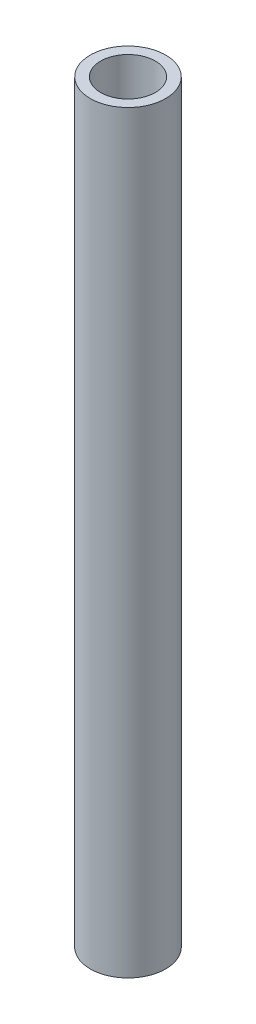
ISO-10303-21;
HEADER;
FILE_DESCRIPTION(('STEP AP214'),'2;1');
FILE_NAME('part.step','',(''),(''),'','','');
FILE_SCHEMA(('AUTOMOTIVE_DESIGN { 1 0 10303 214 1 1 1 1 }'));
ENDSEC;
DATA;
#1=APPLICATION_CONTEXT('core data for automotive mechanical design processes');
#2=APPLICATION_PROTOCOL_DEFINITION('international standard','automotive_design',2000,#1);
#3=PRODUCT_CONTEXT('',#1,'mechanical');
#4=PRODUCT('Part','Part','',(#3));
#5=PRODUCT_RELATED_PRODUCT_CATEGORY('part','',(#4));
#6=PRODUCT_DEFINITION_FORMATION('','',#4);
#7=PRODUCT_DEFINITION_CONTEXT('part definition',#1,'design');
#8=PRODUCT_DEFINITION('design','',#6,#7);
#9=PRODUCT_DEFINITION_SHAPE('','',#8);
#10=(LENGTH_UNIT() NAMED_UNIT(*) SI_UNIT(.MILLI.,.METRE.));
#11=(NAMED_UNIT(*) PLANE_ANGLE_UNIT() SI_UNIT($,.RADIAN.));
#12=(NAMED_UNIT(*) SI_UNIT($,.STERADIAN.) SOLID_ANGLE_UNIT());
#13=UNCERTAINTY_MEASURE_WITH_UNIT(LENGTH_MEASURE(1.E-05),#10,'distance_accuracy_value','');
#14=(GEOMETRIC_REPRESENTATION_CONTEXT(3) GLOBAL_UNCERTAINTY_ASSIGNED_CONTEXT((#13)) GLOBAL_UNIT_ASSIGNED_CONTEXT((#10,
#11,#12)) REPRESENTATION_CONTEXT('',''));
#15=CARTESIAN_POINT('',(0.,0.,0.));
#16=DIRECTION('',(0.,0.,1.));
#17=DIRECTION('',(1.,0.,0.));
#18=AXIS2_PLACEMENT_3D('',#15,#16,#17);
#19=CARTESIAN_POINT('',(0.,80.,0.));
#20=DIRECTION('',(0.,-1.,0.));
#21=DIRECTION('',(0.,0.,-1.));
#22=AXIS2_PLACEMENT_3D('',#19,#20,#21);
#23=CYLINDRICAL_SURFACE('',#22,4.);
#24=CARTESIAN_POINT('',(0.,80.,0.));
#25=DIRECTION('',(0.,1.,0.));
#26=DIRECTION('',(0.,0.,1.));
#27=AXIS2_PLACEMENT_3D('',#24,#25,#26);
#28=CIRCLE('',#27,4.);
#29=CARTESIAN_POINT('',(0.,80.,4.));
#30=VERTEX_POINT('',#29);
#31=EDGE_CURVE('E10',#30,#30,#28,.T.);
#32=ORIENTED_EDGE('',*,*,#31,.F.);
#33=EDGE_LOOP('',(#32));
#34=FACE_BOUND('',#33,.T.);
#35=CARTESIAN_POINT('',(0.,0.,0.));
#36=DIRECTION('',(0.,1.,0.));
#37=DIRECTION('',(0.,0.,1.));
#38=AXIS2_PLACEMENT_3D('',#35,#36,#37);
#39=CIRCLE('',#38,4.);
#40=CARTESIAN_POINT('',(0.,0.,4.));
#41=VERTEX_POINT('',#40);
#42=EDGE_CURVE('E35',#41,#41,#39,.T.);
#43=ORIENTED_EDGE('',*,*,#42,.T.);
#44=EDGE_LOOP('',(#43));
#45=FACE_BOUND('',#44,.T.);
#46=ADVANCED_FACE('F32',(#34,#45),#23,.T.);
#47=CARTESIAN_POINT('',(0.,80.,0.));
#48=DIRECTION('',(0.,1.,0.));
#49=DIRECTION('',(0.,0.,1.));
#50=AXIS2_PLACEMENT_3D('',#47,#48,#49);
#51=PLANE('',#50);
#52=CARTESIAN_POINT('',(0.,80.,0.));
#53=DIRECTION('',(0.,1.,0.));
#54=DIRECTION('',(0.,0.,1.));
#55=AXIS2_PLACEMENT_3D('',#52,#53,#54);
#56=CIRCLE('',#55,2.89941909732522);
#57=CARTESIAN_POINT('',(0.,80.,2.89941909732522));
#58=VERTEX_POINT('',#57);
#59=EDGE_CURVE('E44',#58,#58,#56,.T.);
#60=ORIENTED_EDGE('',*,*,#59,.F.);
#61=EDGE_LOOP('',(#60));
#62=FACE_BOUND('',#61,.T.);
#63=ORIENTED_EDGE('',*,*,#31,.T.);
#64=EDGE_LOOP('',(#63));
#65=FACE_BOUND('',#64,.T.);
#66=ADVANCED_FACE('F59',(#62,#65),#51,.T.);
#67=CARTESIAN_POINT('',(0.,0.,0.));
#68=DIRECTION('',(0.,1.,0.));
#69=DIRECTION('',(0.,0.,1.));
#70=AXIS2_PLACEMENT_3D('',#67,#68,#69);
#71=PLANE('',#70);
#72=ORIENTED_EDGE('',*,*,#42,.F.);
#73=EDGE_LOOP('',(#72));
#74=FACE_BOUND('',#73,.T.);
#75=ADVANCED_FACE('F55',(#74),#71,.F.);
#76=CARTESIAN_POINT('',(0.,70.,0.));
#77=DIRECTION('',(0.,1.,0.));
#78=DIRECTION('',(0.,0.,1.));
#79=AXIS2_PLACEMENT_3D('',#76,#77,#78);
#80=CYLINDRICAL_SURFACE('',#79,2.89941909732522);
#81=CARTESIAN_POINT('',(0.,70.,0.));
#82=DIRECTION('',(0.,1.,0.));
#83=DIRECTION('',(0.,0.,1.));
#84=AXIS2_PLACEMENT_3D('',#81,#82,#83);
#85=CIRCLE('',#84,2.89941909732522);
#86=CARTESIAN_POINT('',(0.,70.,2.89941909732522));
#87=VERTEX_POINT('',#86);
#88=EDGE_CURVE('E42',#87,#87,#85,.T.);
#89=ORIENTED_EDGE('',*,*,#88,.F.);
#90=EDGE_LOOP('',(#89));
#91=FACE_BOUND('',#90,.T.);
#92=ORIENTED_EDGE('',*,*,#59,.T.);
#93=EDGE_LOOP('',(#92));
#94=FACE_BOUND('',#93,.T.);
#95=ADVANCED_FACE('F52',(#91,#94),#80,.F.);
#96=CARTESIAN_POINT('',(0.,70.,0.));
#97=DIRECTION('',(0.,1.,0.));
#98=DIRECTION('',(0.,0.,1.));
#99=AXIS2_PLACEMENT_3D('',#96,#97,#98);
#100=PLANE('',#99);
#101=ORIENTED_EDGE('',*,*,#88,.T.);
#102=EDGE_LOOP('',(#101));
#103=FACE_BOUND('',#102,.T.);
#104=ADVANCED_FACE('F50',(#103),#100,.T.);
#105=CLOSED_SHELL('',(#46,#66,#75,#95,#104));
#106=MANIFOLD_SOLID_BREP('B2',#105);
#107=ADVANCED_BREP_SHAPE_REPRESENTATION('',(#18,#106),#14);
#108=SHAPE_DEFINITION_REPRESENTATION(#9,#107);
ENDSEC;
END-ISO-10303-21;
